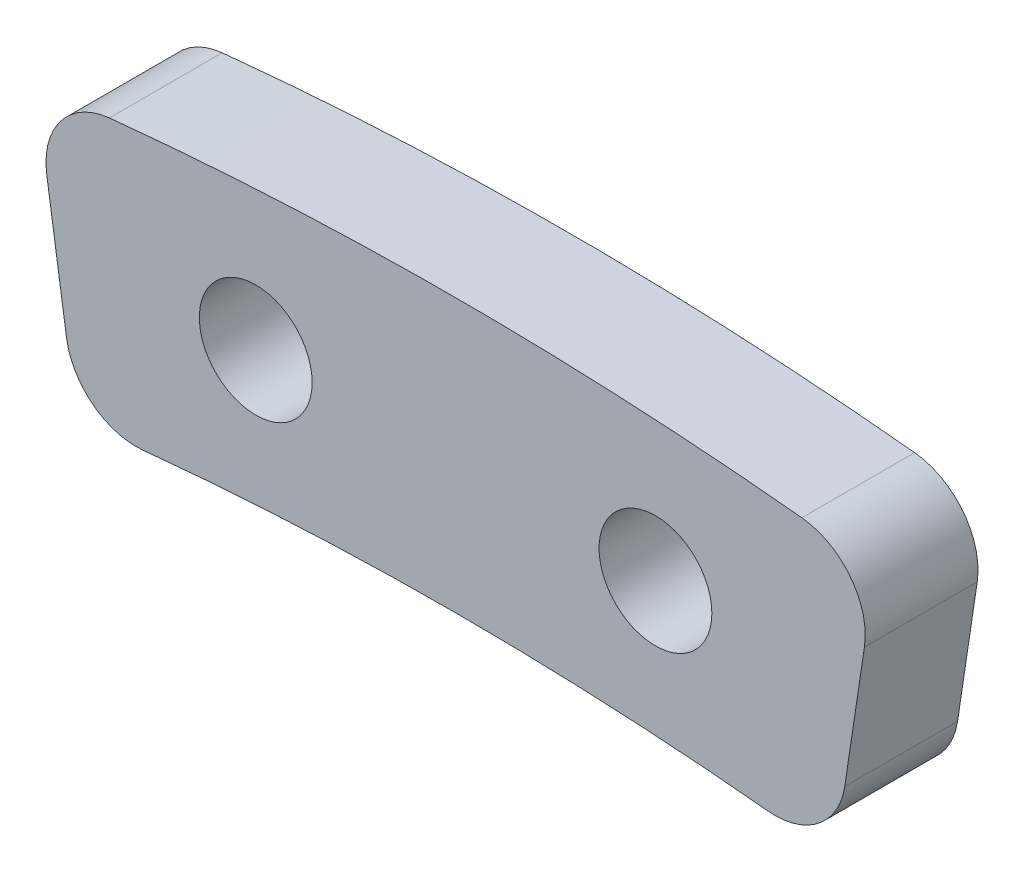
ISO-10303-21;
HEADER;
FILE_DESCRIPTION(('STEP AP214'),'2;1');
FILE_NAME('part.step','',(''),(''),'','','');
FILE_SCHEMA(('AUTOMOTIVE_DESIGN { 1 0 10303 214 1 1 1 1 }'));
ENDSEC;
DATA;
#1=APPLICATION_CONTEXT('core data for automotive mechanical design processes');
#2=APPLICATION_PROTOCOL_DEFINITION('international standard','automotive_design',2000,#1);
#3=PRODUCT_CONTEXT('',#1,'mechanical');
#4=PRODUCT('Part','Part','',(#3));
#5=PRODUCT_RELATED_PRODUCT_CATEGORY('part','',(#4));
#6=PRODUCT_DEFINITION_FORMATION('','',#4);
#7=PRODUCT_DEFINITION_CONTEXT('part definition',#1,'design');
#8=PRODUCT_DEFINITION('design','',#6,#7);
#9=PRODUCT_DEFINITION_SHAPE('','',#8);
#10=(LENGTH_UNIT() NAMED_UNIT(*) SI_UNIT(.MILLI.,.METRE.));
#11=(NAMED_UNIT(*) PLANE_ANGLE_UNIT() SI_UNIT($,.RADIAN.));
#12=(NAMED_UNIT(*) SI_UNIT($,.STERADIAN.) SOLID_ANGLE_UNIT());
#13=UNCERTAINTY_MEASURE_WITH_UNIT(LENGTH_MEASURE(1.E-05),#10,'distance_accuracy_value','');
#14=(GEOMETRIC_REPRESENTATION_CONTEXT(3) GLOBAL_UNCERTAINTY_ASSIGNED_CONTEXT((#13)) GLOBAL_UNIT_ASSIGNED_CONTEXT((#10,
#11,#12)) REPRESENTATION_CONTEXT('',''));
#15=CARTESIAN_POINT('',(0.,0.,0.));
#16=DIRECTION('',(0.,0.,1.));
#17=DIRECTION('',(1.,0.,0.));
#18=AXIS2_PLACEMENT_3D('',#15,#16,#17);
#19=CARTESIAN_POINT('',(0.,0.,3.2));
#20=DIRECTION('',(0.,0.,-1.));
#21=DIRECTION('',(-1.,0.,0.));
#22=AXIS2_PLACEMENT_3D('',#19,#20,#21);
#23=CYLINDRICAL_SURFACE('',#22,97.372);
#24=CARTESIAN_POINT('',(0.,0.,3.2));
#25=DIRECTION('',(0.,0.,1.));
#26=DIRECTION('',(1.,0.,0.));
#27=AXIS2_PLACEMENT_3D('',#24,#25,#26);
#28=CIRCLE('',#27,97.372);
#29=CARTESIAN_POINT('',(9.82317013732213,96.8752378704343,3.2));
#30=VERTEX_POINT('',#29);
#31=CARTESIAN_POINT('',(-9.82317013732212,96.8752378704343,3.2));
#32=VERTEX_POINT('',#31);
#33=EDGE_CURVE('E126',#30,#32,#28,.T.);
#34=ORIENTED_EDGE('',*,*,#33,.F.);
#35=DIRECTION('',(0.,0.,-1.));
#36=VECTOR('',#35,1.);
#37=CARTESIAN_POINT('',(9.82317013732213,96.8752378704343,3.2));
#38=LINE('',#37,#36);
#39=CARTESIAN_POINT('',(9.82317013732213,96.8752378704343,0.));
#40=VERTEX_POINT('',#39);
#41=EDGE_CURVE('E111',#30,#40,#38,.T.);
#42=ORIENTED_EDGE('',*,*,#41,.T.);
#43=CARTESIAN_POINT('',(0.,0.,0.));
#44=DIRECTION('',(0.,0.,1.));
#45=DIRECTION('',(1.,0.,0.));
#46=AXIS2_PLACEMENT_3D('',#43,#44,#45);
#47=CIRCLE('',#46,97.372);
#48=CARTESIAN_POINT('',(-9.82317013732212,96.8752378704343,0.));
#49=VERTEX_POINT('',#48);
#50=EDGE_CURVE('E123',#40,#49,#47,.T.);
#51=ORIENTED_EDGE('',*,*,#50,.T.);
#52=DIRECTION('',(0.,0.,-1.));
#53=VECTOR('',#52,1.);
#54=CARTESIAN_POINT('',(-9.82317013732212,96.8752378704343,3.2));
#55=LINE('',#54,#53);
#56=EDGE_CURVE('E128',#49,#32,#55,.F.);
#57=ORIENTED_EDGE('',*,*,#56,.T.);
#58=EDGE_LOOP('',(#34,#42,#51,#57));
#59=FACE_BOUND('',#58,.T.);
#60=ADVANCED_FACE('F41',(#59),#23,.T.);
#61=CARTESIAN_POINT('',(-11.9086095461443,96.6410440893386,3.2));
#62=DIRECTION('',(0.988830826225129,0.149042266176173,0.));
#63=DIRECTION('',(-0.149042266176173,0.988830826225129,0.));
#64=AXIS2_PLACEMENT_3D('',#61,#62,#63);
#65=PLANE('',#64);
#66=DIRECTION('',(0.149042266176173,-0.988830826225129,0.));
#67=VECTOR('',#66,1.);
#68=CARTESIAN_POINT('',(-11.9086095461443,96.6410440893386,0.));
#69=LINE('',#68,#67);
#70=CARTESIAN_POINT('',(-11.5990659815868,94.5873567256999,0.));
#71=VERTEX_POINT('',#70);
#72=CARTESIAN_POINT('',(-11.0403666392573,90.8806287856261,0.));
#73=VERTEX_POINT('',#72);
#74=EDGE_CURVE('E132',#71,#73,#69,.T.);
#75=ORIENTED_EDGE('',*,*,#74,.T.);
#76=DIRECTION('',(0.,0.,-1.));
#77=VECTOR('',#76,1.);
#78=CARTESIAN_POINT('',(-11.0403666392573,90.8806287856261,3.2));
#79=LINE('',#78,#77);
#80=CARTESIAN_POINT('',(-11.0403666392573,90.8806287856261,3.2));
#81=VERTEX_POINT('',#80);
#82=EDGE_CURVE('E11',#73,#81,#79,.F.);
#83=ORIENTED_EDGE('',*,*,#82,.T.);
#84=DIRECTION('',(0.149042266176173,-0.988830826225129,0.));
#85=VECTOR('',#84,1.);
#86=CARTESIAN_POINT('',(-11.9086095461443,96.6410440893386,3.2));
#87=LINE('',#86,#85);
#88=CARTESIAN_POINT('',(-11.5990659815868,94.5873567256999,3.2));
#89=VERTEX_POINT('',#88);
#90=EDGE_CURVE('E172',#89,#81,#87,.T.);
#91=ORIENTED_EDGE('',*,*,#90,.F.);
#92=DIRECTION('',(0.,0.,-1.));
#93=VECTOR('',#92,1.);
#94=CARTESIAN_POINT('',(-11.5990659815868,94.5873567256999,3.2));
#95=LINE('',#94,#93);
#96=EDGE_CURVE('E49',#89,#71,#95,.T.);
#97=ORIENTED_EDGE('',*,*,#96,.T.);
#98=EDGE_LOOP('',(#75,#83,#91,#97));
#99=FACE_BOUND('',#98,.T.);
#100=ADVANCED_FACE('F170',(#99),#65,.F.);
#101=CARTESIAN_POINT('',(0.,0.,3.2));
#102=DIRECTION('',(0.,0.,-1.));
#103=DIRECTION('',(-1.,0.,0.));
#104=AXIS2_PLACEMENT_3D('',#101,#102,#103);
#105=CYLINDRICAL_SURFACE('',#104,89.628);
#106=CARTESIAN_POINT('',(0.,0.,0.));
#107=DIRECTION('',(0.,0.,-1.));
#108=DIRECTION('',(1.,0.,0.));
#109=AXIS2_PLACEMENT_3D('',#106,#107,#108);
#110=CIRCLE('',#109,89.628);
#111=CARTESIAN_POINT('',(-8.86488979959775,89.1885200731629,0.));
#112=VERTEX_POINT('',#111);
#113=CARTESIAN_POINT('',(8.86488979959775,89.1885200731629,0.));
#114=VERTEX_POINT('',#113);
#115=EDGE_CURVE('E136',#112,#114,#110,.T.);
#116=ORIENTED_EDGE('',*,*,#115,.T.);
#117=DIRECTION('',(0.,0.,-1.));
#118=VECTOR('',#117,1.);
#119=CARTESIAN_POINT('',(8.86488979959775,89.1885200731629,3.2));
#120=LINE('',#119,#118);
#121=CARTESIAN_POINT('',(8.86488979959775,89.1885200731629,3.2));
#122=VERTEX_POINT('',#121);
#123=EDGE_CURVE('E56',#114,#122,#120,.F.);
#124=ORIENTED_EDGE('',*,*,#123,.T.);
#125=CARTESIAN_POINT('',(0.,0.,3.2));
#126=DIRECTION('',(0.,0.,-1.));
#127=DIRECTION('',(1.,0.,0.));
#128=AXIS2_PLACEMENT_3D('',#125,#126,#127);
#129=CIRCLE('',#128,89.628);
#130=CARTESIAN_POINT('',(-8.86488979959775,89.1885200731629,3.2));
#131=VERTEX_POINT('',#130);
#132=EDGE_CURVE('E180',#131,#122,#129,.T.);
#133=ORIENTED_EDGE('',*,*,#132,.F.);
#134=DIRECTION('',(0.,0.,-1.));
#135=VECTOR('',#134,1.);
#136=CARTESIAN_POINT('',(-8.86488979959775,89.1885200731629,3.2));
#137=LINE('',#136,#135);
#138=EDGE_CURVE('E163',#131,#112,#137,.T.);
#139=ORIENTED_EDGE('',*,*,#138,.T.);
#140=EDGE_LOOP('',(#116,#124,#133,#139));
#141=FACE_BOUND('',#140,.T.);
#142=ADVANCED_FACE('F179',(#141),#105,.F.);
#143=CARTESIAN_POINT('',(10.7539692790008,88.9805064536402,3.2));
#144=DIRECTION('',(-0.988830826225129,0.149042266176172,0.));
#145=DIRECTION('',(-0.149042266176172,-0.988830826225129,0.));
#146=AXIS2_PLACEMENT_3D('',#143,#144,#145);
#147=PLANE('',#146);
#148=DIRECTION('',(0.149042266176172,0.988830826225129,0.));
#149=VECTOR('',#148,1.);
#150=CARTESIAN_POINT('',(10.7539692790008,88.9805064536402,0.));
#151=LINE('',#150,#149);
#152=CARTESIAN_POINT('',(11.0403666392573,90.8806287856261,0.));
#153=VERTEX_POINT('',#152);
#154=CARTESIAN_POINT('',(11.5990659815868,94.5873567256999,0.));
#155=VERTEX_POINT('',#154);
#156=EDGE_CURVE('E146',#153,#155,#151,.T.);
#157=ORIENTED_EDGE('',*,*,#156,.T.);
#158=DIRECTION('',(0.,0.,-1.));
#159=VECTOR('',#158,1.);
#160=CARTESIAN_POINT('',(11.5990659815868,94.5873567256999,3.2));
#161=LINE('',#160,#159);
#162=CARTESIAN_POINT('',(11.5990659815868,94.5873567256999,3.2));
#163=VERTEX_POINT('',#162);
#164=EDGE_CURVE('E112',#155,#163,#161,.F.);
#165=ORIENTED_EDGE('',*,*,#164,.T.);
#166=DIRECTION('',(0.149042266176172,0.988830826225129,0.));
#167=VECTOR('',#166,1.);
#168=CARTESIAN_POINT('',(10.7539692790008,88.9805064536402,3.2));
#169=LINE('',#168,#167);
#170=CARTESIAN_POINT('',(11.0403666392573,90.8806287856261,3.2));
#171=VERTEX_POINT('',#170);
#172=EDGE_CURVE('E142',#171,#163,#169,.T.);
#173=ORIENTED_EDGE('',*,*,#172,.F.);
#174=DIRECTION('',(0.,0.,-1.));
#175=VECTOR('',#174,1.);
#176=CARTESIAN_POINT('',(11.0403666392573,90.8806287856261,3.2));
#177=LINE('',#176,#175);
#178=EDGE_CURVE('E117',#171,#153,#177,.T.);
#179=ORIENTED_EDGE('',*,*,#178,.T.);
#180=EDGE_LOOP('',(#157,#165,#173,#179));
#181=FACE_BOUND('',#180,.T.);
#182=ADVANCED_FACE('F200',(#181),#147,.F.);
#183=CARTESIAN_POINT('',(0.,0.,3.2));
#184=DIRECTION('',(0.,0.,1.));
#185=DIRECTION('',(1.,0.,0.));
#186=AXIS2_PLACEMENT_3D('',#183,#184,#185);
#187=PLANE('',#186);
#188=CARTESIAN_POINT('',(5.67031234092371,93.2500774675933,3.2));
#189=DIRECTION('',(0.,0.,1.));
#190=DIRECTION('',(1.,0.,0.));
#191=AXIS2_PLACEMENT_3D('',#188,#189,#190);
#192=CIRCLE('',#191,1.6);
#193=CARTESIAN_POINT('',(7.27031234092372,93.2500774675933,3.2));
#194=VERTEX_POINT('',#193);
#195=EDGE_CURVE('E139',#194,#194,#192,.T.);
#196=ORIENTED_EDGE('',*,*,#195,.F.);
#197=EDGE_LOOP('',(#196));
#198=FACE_BOUND('',#197,.T.);
#199=CARTESIAN_POINT('',(-5.67031234092371,93.2500774675934,3.2));
#200=DIRECTION('',(0.,0.,1.));
#201=DIRECTION('',(1.,0.,0.));
#202=AXIS2_PLACEMENT_3D('',#199,#200,#201);
#203=CIRCLE('',#202,1.6);
#204=CARTESIAN_POINT('',(-4.07031234092371,93.2500774675934,3.2));
#205=VERTEX_POINT('',#204);
#206=EDGE_CURVE('E189',#205,#205,#203,.T.);
#207=ORIENTED_EDGE('',*,*,#206,.F.);
#208=EDGE_LOOP('',(#207));
#209=FACE_BOUND('',#208,.T.);
#210=ORIENTED_EDGE('',*,*,#172,.T.);
#211=CARTESIAN_POINT('',(9.62140432913657,94.8854412580522,3.2));
#212=DIRECTION('',(0.,0.,1.));
#213=DIRECTION('',(1.,0.,0.));
#214=AXIS2_PLACEMENT_3D('',#211,#212,#213);
#215=CIRCLE('',#214,2.);
#216=EDGE_CURVE('E161',#163,#30,#215,.T.);
#217=ORIENTED_EDGE('',*,*,#216,.T.);
#218=ORIENTED_EDGE('',*,*,#33,.T.);
#219=CARTESIAN_POINT('',(-9.62140432913657,94.8854412580522,3.2));
#220=DIRECTION('',(0.,0.,1.));
#221=DIRECTION('',(1.,0.,0.));
#222=AXIS2_PLACEMENT_3D('',#219,#220,#221);
#223=CIRCLE('',#222,2.);
#224=EDGE_CURVE('E156',#32,#89,#223,.T.);
#225=ORIENTED_EDGE('',*,*,#224,.T.);
#226=ORIENTED_EDGE('',*,*,#90,.T.);
#227=CARTESIAN_POINT('',(-9.06270498680705,91.1787133179785,3.2));
#228=DIRECTION('',(0.,0.,1.));
#229=DIRECTION('',(1.,0.,0.));
#230=AXIS2_PLACEMENT_3D('',#227,#228,#229);
#231=CIRCLE('',#230,2.);
#232=EDGE_CURVE('E63',#81,#131,#231,.T.);
#233=ORIENTED_EDGE('',*,*,#232,.T.);
#234=ORIENTED_EDGE('',*,*,#132,.T.);
#235=CARTESIAN_POINT('',(9.06270498680706,91.1787133179785,3.2));
#236=DIRECTION('',(0.,0.,1.));
#237=DIRECTION('',(1.,0.,0.));
#238=AXIS2_PLACEMENT_3D('',#235,#236,#237);
#239=CIRCLE('',#238,2.);
#240=EDGE_CURVE('E159',#122,#171,#239,.T.);
#241=ORIENTED_EDGE('',*,*,#240,.T.);
#242=EDGE_LOOP('',(#210,#217,#218,#225,#226,#233,#234,#241));
#243=FACE_BOUND('',#242,.T.);
#244=ADVANCED_FACE('F197',(#198,#209,#243),#187,.T.);
#245=CARTESIAN_POINT('',(0.,0.,0.));
#246=DIRECTION('',(0.,0.,1.));
#247=DIRECTION('',(1.,0.,0.));
#248=AXIS2_PLACEMENT_3D('',#245,#246,#247);
#249=PLANE('',#248);
#250=CARTESIAN_POINT('',(5.67031234092371,93.2500774675933,0.));
#251=DIRECTION('',(0.,0.,1.));
#252=DIRECTION('',(1.,0.,0.));
#253=AXIS2_PLACEMENT_3D('',#250,#251,#252);
#254=CIRCLE('',#253,1.6);
#255=CARTESIAN_POINT('',(7.27031234092372,93.2500774675933,0.));
#256=VERTEX_POINT('',#255);
#257=EDGE_CURVE('E133',#256,#256,#254,.T.);
#258=ORIENTED_EDGE('',*,*,#257,.T.);
#259=EDGE_LOOP('',(#258));
#260=FACE_BOUND('',#259,.T.);
#261=CARTESIAN_POINT('',(-5.67031234092371,93.2500774675934,0.));
#262=DIRECTION('',(0.,0.,1.));
#263=DIRECTION('',(1.,0.,0.));
#264=AXIS2_PLACEMENT_3D('',#261,#262,#263);
#265=CIRCLE('',#264,1.6);
#266=CARTESIAN_POINT('',(-4.07031234092371,93.2500774675934,0.));
#267=VERTEX_POINT('',#266);
#268=EDGE_CURVE('E186',#267,#267,#265,.T.);
#269=ORIENTED_EDGE('',*,*,#268,.T.);
#270=EDGE_LOOP('',(#269));
#271=FACE_BOUND('',#270,.T.);
#272=ORIENTED_EDGE('',*,*,#50,.F.);
#273=CARTESIAN_POINT('',(9.62140432913657,94.8854412580522,0.));
#274=DIRECTION('',(0.,0.,1.));
#275=DIRECTION('',(1.,0.,0.));
#276=AXIS2_PLACEMENT_3D('',#273,#274,#275);
#277=CIRCLE('',#276,2.);
#278=EDGE_CURVE('E107',#40,#155,#277,.F.);
#279=ORIENTED_EDGE('',*,*,#278,.T.);
#280=ORIENTED_EDGE('',*,*,#156,.F.);
#281=CARTESIAN_POINT('',(9.06270498680706,91.1787133179785,0.));
#282=DIRECTION('',(0.,0.,1.));
#283=DIRECTION('',(1.,0.,0.));
#284=AXIS2_PLACEMENT_3D('',#281,#282,#283);
#285=CIRCLE('',#284,2.);
#286=EDGE_CURVE('E118',#153,#114,#285,.F.);
#287=ORIENTED_EDGE('',*,*,#286,.T.);
#288=ORIENTED_EDGE('',*,*,#115,.F.);
#289=CARTESIAN_POINT('',(-9.06270498680705,91.1787133179785,0.));
#290=DIRECTION('',(0.,0.,1.));
#291=DIRECTION('',(1.,0.,0.));
#292=AXIS2_PLACEMENT_3D('',#289,#290,#291);
#293=CIRCLE('',#292,2.);
#294=EDGE_CURVE('E150',#112,#73,#293,.F.);
#295=ORIENTED_EDGE('',*,*,#294,.T.);
#296=ORIENTED_EDGE('',*,*,#74,.F.);
#297=CARTESIAN_POINT('',(-9.62140432913657,94.8854412580522,0.));
#298=DIRECTION('',(0.,0.,1.));
#299=DIRECTION('',(1.,0.,0.));
#300=AXIS2_PLACEMENT_3D('',#297,#298,#299);
#301=CIRCLE('',#300,2.);
#302=EDGE_CURVE('E127',#71,#49,#301,.F.);
#303=ORIENTED_EDGE('',*,*,#302,.T.);
#304=EDGE_LOOP('',(#272,#279,#280,#287,#288,#295,#296,#303));
#305=FACE_BOUND('',#304,.T.);
#306=ADVANCED_FACE('F130',(#260,#271,#305),#249,.F.);
#307=CARTESIAN_POINT('',(9.62140432913657,94.8854412580522,3.2));
#308=DIRECTION('',(0.,0.,-1.));
#309=DIRECTION('',(-1.,0.,0.));
#310=AXIS2_PLACEMENT_3D('',#307,#308,#309);
#311=CYLINDRICAL_SURFACE('',#310,2.);
#312=ORIENTED_EDGE('',*,*,#216,.F.);
#313=ORIENTED_EDGE('',*,*,#164,.F.);
#314=ORIENTED_EDGE('',*,*,#278,.F.);
#315=ORIENTED_EDGE('',*,*,#41,.F.);
#316=EDGE_LOOP('',(#312,#313,#314,#315));
#317=FACE_BOUND('',#316,.T.);
#318=ADVANCED_FACE('F110',(#317),#311,.T.);
#319=CARTESIAN_POINT('',(9.06270498680706,91.1787133179785,3.2));
#320=DIRECTION('',(0.,0.,-1.));
#321=DIRECTION('',(-1.,0.,0.));
#322=AXIS2_PLACEMENT_3D('',#319,#320,#321);
#323=CYLINDRICAL_SURFACE('',#322,2.);
#324=ORIENTED_EDGE('',*,*,#240,.F.);
#325=ORIENTED_EDGE('',*,*,#123,.F.);
#326=ORIENTED_EDGE('',*,*,#286,.F.);
#327=ORIENTED_EDGE('',*,*,#178,.F.);
#328=EDGE_LOOP('',(#324,#325,#326,#327));
#329=FACE_BOUND('',#328,.T.);
#330=ADVANCED_FACE('F207',(#329),#323,.T.);
#331=CARTESIAN_POINT('',(-9.06270498680705,91.1787133179785,3.2));
#332=DIRECTION('',(0.,0.,-1.));
#333=DIRECTION('',(-1.,0.,0.));
#334=AXIS2_PLACEMENT_3D('',#331,#332,#333);
#335=CYLINDRICAL_SURFACE('',#334,2.);
#336=ORIENTED_EDGE('',*,*,#232,.F.);
#337=ORIENTED_EDGE('',*,*,#82,.F.);
#338=ORIENTED_EDGE('',*,*,#294,.F.);
#339=ORIENTED_EDGE('',*,*,#138,.F.);
#340=EDGE_LOOP('',(#336,#337,#338,#339));
#341=FACE_BOUND('',#340,.T.);
#342=ADVANCED_FACE('F178',(#341),#335,.T.);
#343=CARTESIAN_POINT('',(-9.62140432913657,94.8854412580522,3.2));
#344=DIRECTION('',(0.,0.,-1.));
#345=DIRECTION('',(-1.,0.,0.));
#346=AXIS2_PLACEMENT_3D('',#343,#344,#345);
#347=CYLINDRICAL_SURFACE('',#346,2.);
#348=ORIENTED_EDGE('',*,*,#224,.F.);
#349=ORIENTED_EDGE('',*,*,#56,.F.);
#350=ORIENTED_EDGE('',*,*,#302,.F.);
#351=ORIENTED_EDGE('',*,*,#96,.F.);
#352=EDGE_LOOP('',(#348,#349,#350,#351));
#353=FACE_BOUND('',#352,.T.);
#354=ADVANCED_FACE('F43',(#353),#347,.T.);
#355=CARTESIAN_POINT('',(-5.67031234092371,93.2500774675934,0.));
#356=DIRECTION('',(0.,0.,1.));
#357=DIRECTION('',(1.,0.,0.));
#358=AXIS2_PLACEMENT_3D('',#355,#356,#357);
#359=CYLINDRICAL_SURFACE('',#358,1.6);
#360=ORIENTED_EDGE('',*,*,#268,.F.);
#361=EDGE_LOOP('',(#360));
#362=FACE_BOUND('',#361,.T.);
#363=ORIENTED_EDGE('',*,*,#206,.T.);
#364=EDGE_LOOP('',(#363));
#365=FACE_BOUND('',#364,.T.);
#366=ADVANCED_FACE('F229',(#362,#365),#359,.F.);
#367=CARTESIAN_POINT('',(5.67031234092371,93.2500774675933,0.));
#368=DIRECTION('',(0.,0.,1.));
#369=DIRECTION('',(1.,0.,0.));
#370=AXIS2_PLACEMENT_3D('',#367,#368,#369);
#371=CYLINDRICAL_SURFACE('',#370,1.6);
#372=ORIENTED_EDGE('',*,*,#257,.F.);
#373=EDGE_LOOP('',(#372));
#374=FACE_BOUND('',#373,.T.);
#375=ORIENTED_EDGE('',*,*,#195,.T.);
#376=EDGE_LOOP('',(#375));
#377=FACE_BOUND('',#376,.T.);
#378=ADVANCED_FACE('F195',(#374,#377),#371,.F.);
#379=CLOSED_SHELL('',(#60,#100,#142,#182,#244,#306,#318,#330,#342,#354,#366,#378));
#380=MANIFOLD_SOLID_BREP('B2',#379);
#381=ADVANCED_BREP_SHAPE_REPRESENTATION('',(#18,#380),#14);
#382=SHAPE_DEFINITION_REPRESENTATION(#9,#381);
ENDSEC;
END-ISO-10303-21;
